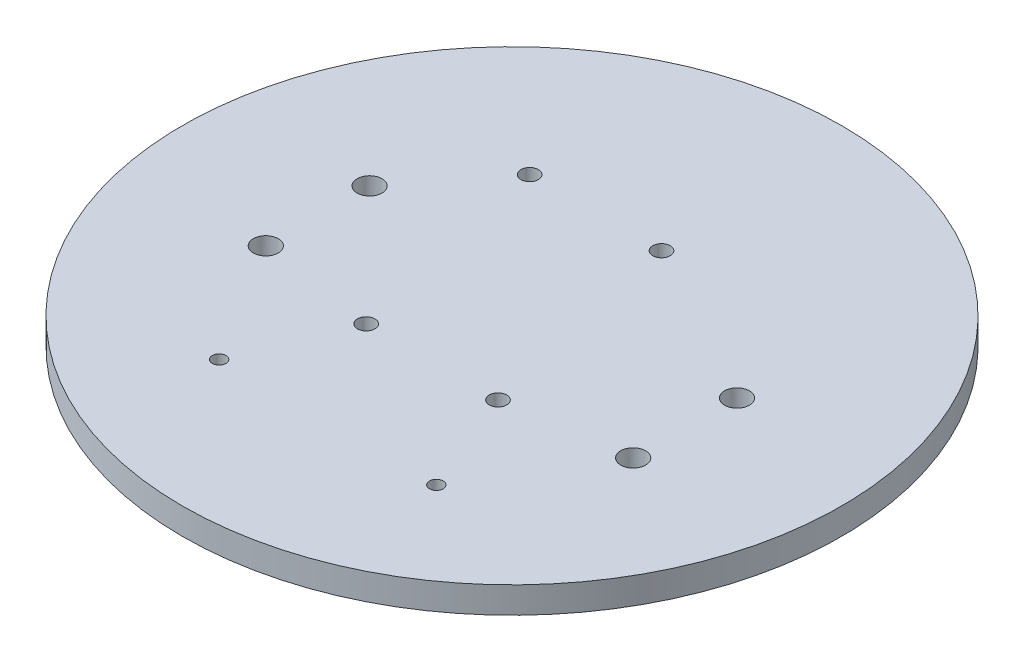
ISO-10303-21;
HEADER;
FILE_DESCRIPTION(('STEP AP214'),'2;1');
FILE_NAME('part.step','',(''),(''),'','','');
FILE_SCHEMA(('AUTOMOTIVE_DESIGN { 1 0 10303 214 1 1 1 1 }'));
ENDSEC;
DATA;
#1=APPLICATION_CONTEXT('core data for automotive mechanical design processes');
#2=APPLICATION_PROTOCOL_DEFINITION('international standard','automotive_design',2000,#1);
#3=PRODUCT_CONTEXT('',#1,'mechanical');
#4=PRODUCT('Part','Part','',(#3));
#5=PRODUCT_RELATED_PRODUCT_CATEGORY('part','',(#4));
#6=PRODUCT_DEFINITION_FORMATION('','',#4);
#7=PRODUCT_DEFINITION_CONTEXT('part definition',#1,'design');
#8=PRODUCT_DEFINITION('design','',#6,#7);
#9=PRODUCT_DEFINITION_SHAPE('','',#8);
#10=(LENGTH_UNIT() NAMED_UNIT(*) SI_UNIT(.MILLI.,.METRE.));
#11=(NAMED_UNIT(*) PLANE_ANGLE_UNIT() SI_UNIT($,.RADIAN.));
#12=(NAMED_UNIT(*) SI_UNIT($,.STERADIAN.) SOLID_ANGLE_UNIT());
#13=UNCERTAINTY_MEASURE_WITH_UNIT(LENGTH_MEASURE(1.E-05),#10,'distance_accuracy_value','');
#14=(GEOMETRIC_REPRESENTATION_CONTEXT(3) GLOBAL_UNCERTAINTY_ASSIGNED_CONTEXT((#13)) GLOBAL_UNIT_ASSIGNED_CONTEXT((#10,
#11,#12)) REPRESENTATION_CONTEXT('',''));
#15=CARTESIAN_POINT('',(0.,0.,0.));
#16=DIRECTION('',(0.,0.,1.));
#17=DIRECTION('',(1.,0.,0.));
#18=AXIS2_PLACEMENT_3D('',#15,#16,#17);
#19=CARTESIAN_POINT('',(0.,3.175,0.));
#20=DIRECTION('',(0.,-1.,0.));
#21=DIRECTION('',(0.,0.,-1.));
#22=AXIS2_PLACEMENT_3D('',#19,#20,#21);
#23=CYLINDRICAL_SURFACE('',#22,79.375);
#24=CARTESIAN_POINT('',(0.,3.175,0.));
#25=DIRECTION('',(0.,1.,0.));
#26=DIRECTION('',(0.,0.,1.));
#27=AXIS2_PLACEMENT_3D('',#24,#25,#26);
#28=CIRCLE('',#27,79.375);
#29=CARTESIAN_POINT('',(0.,3.175,79.375));
#30=VERTEX_POINT('',#29);
#31=EDGE_CURVE('E10',#30,#30,#28,.T.);
#32=ORIENTED_EDGE('',*,*,#31,.F.);
#33=EDGE_LOOP('',(#32));
#34=FACE_BOUND('',#33,.T.);
#35=CARTESIAN_POINT('',(0.,-3.175,0.));
#36=DIRECTION('',(0.,1.,0.));
#37=DIRECTION('',(0.,0.,1.));
#38=AXIS2_PLACEMENT_3D('',#35,#36,#37);
#39=CIRCLE('',#38,79.375);
#40=CARTESIAN_POINT('',(0.,-3.175,79.375));
#41=VERTEX_POINT('',#40);
#42=EDGE_CURVE('E45',#41,#41,#39,.T.);
#43=ORIENTED_EDGE('',*,*,#42,.T.);
#44=EDGE_LOOP('',(#43));
#45=FACE_BOUND('',#44,.T.);
#46=ADVANCED_FACE('F42',(#34,#45),#23,.T.);
#47=CARTESIAN_POINT('',(0.,3.175,0.));
#48=DIRECTION('',(0.,1.,0.));
#49=DIRECTION('',(0.,0.,1.));
#50=AXIS2_PLACEMENT_3D('',#47,#48,#49);
#51=PLANE('',#50);
#52=CARTESIAN_POINT('',(-26.155,3.175,44.3844163281145));
#53=DIRECTION('',(0.,1.,0.));
#54=DIRECTION('',(0.,0.,1.));
#55=AXIS2_PLACEMENT_3D('',#52,#53,#54);
#56=CIRCLE('',#55,1.65);
#57=CARTESIAN_POINT('',(-26.155,3.175,46.0344163281145));
#58=VERTEX_POINT('',#57);
#59=EDGE_CURVE('E110',#58,#58,#56,.T.);
#60=ORIENTED_EDGE('',*,*,#59,.F.);
#61=EDGE_LOOP('',(#60));
#62=FACE_BOUND('',#61,.T.);
#63=CARTESIAN_POINT('',(26.1550000000005,3.175,44.3844163281143));
#64=DIRECTION('',(0.,1.,0.));
#65=DIRECTION('',(0.,0.,1.));
#66=AXIS2_PLACEMENT_3D('',#63,#64,#65);
#67=CIRCLE('',#66,1.65);
#68=CARTESIAN_POINT('',(26.1550000000005,3.175,46.0344163281143));
#69=VERTEX_POINT('',#68);
#70=EDGE_CURVE('E104',#69,#69,#67,.T.);
#71=ORIENTED_EDGE('',*,*,#70,.F.);
#72=EDGE_LOOP('',(#71));
#73=FACE_BOUND('',#72,.T.);
#74=CARTESIAN_POINT('',(-44.245,3.175,-9.94158367188883));
#75=DIRECTION('',(0.,1.,0.));
#76=DIRECTION('',(0.,0.,1.));
#77=AXIS2_PLACEMENT_3D('',#74,#75,#76);
#78=CIRCLE('',#77,3.);
#79=CARTESIAN_POINT('',(-44.245,3.175,-6.94158367188882));
#80=VERTEX_POINT('',#79);
#81=EDGE_CURVE('E98',#80,#80,#78,.T.);
#82=ORIENTED_EDGE('',*,*,#81,.F.);
#83=EDGE_LOOP('',(#82));
#84=FACE_BOUND('',#83,.T.);
#85=CARTESIAN_POINT('',(-44.245,3.175,15.0584163281112));
#86=DIRECTION('',(0.,1.,0.));
#87=DIRECTION('',(0.,0.,1.));
#88=AXIS2_PLACEMENT_3D('',#85,#86,#87);
#89=CIRCLE('',#88,3.);
#90=CARTESIAN_POINT('',(-44.245,3.175,18.0584163281112));
#91=VERTEX_POINT('',#90);
#92=EDGE_CURVE('E92',#91,#91,#89,.T.);
#93=ORIENTED_EDGE('',*,*,#92,.F.);
#94=EDGE_LOOP('',(#93));
#95=FACE_BOUND('',#94,.T.);
#96=CARTESIAN_POINT('',(44.245,3.175,-9.94158367188884));
#97=DIRECTION('',(0.,1.,0.));
#98=DIRECTION('',(0.,0.,1.));
#99=AXIS2_PLACEMENT_3D('',#96,#97,#98);
#100=CIRCLE('',#99,3.);
#101=CARTESIAN_POINT('',(44.245,3.175,-6.94158367188883));
#102=VERTEX_POINT('',#101);
#103=EDGE_CURVE('E86',#102,#102,#100,.T.);
#104=ORIENTED_EDGE('',*,*,#103,.F.);
#105=EDGE_LOOP('',(#104));
#106=FACE_BOUND('',#105,.T.);
#107=CARTESIAN_POINT('',(44.245,3.175,15.0584163281112));
#108=DIRECTION('',(0.,1.,0.));
#109=DIRECTION('',(0.,0.,1.));
#110=AXIS2_PLACEMENT_3D('',#107,#108,#109);
#111=CIRCLE('',#110,3.);
#112=CARTESIAN_POINT('',(44.245,3.175,18.0584163281112));
#113=VERTEX_POINT('',#112);
#114=EDGE_CURVE('E80',#113,#113,#111,.T.);
#115=ORIENTED_EDGE('',*,*,#114,.F.);
#116=EDGE_LOOP('',(#115));
#117=FACE_BOUND('',#116,.T.);
#118=CARTESIAN_POINT('',(-27.3188086,3.175,-31.5711836718892));
#119=DIRECTION('',(0.,1.,0.));
#120=DIRECTION('',(0.,0.,1.));
#121=AXIS2_PLACEMENT_3D('',#118,#119,#120);
#122=CIRCLE('',#121,2.1);
#123=CARTESIAN_POINT('',(-27.3188086,3.175,-29.4711836718892));
#124=VERTEX_POINT('',#123);
#125=EDGE_CURVE('E74',#124,#124,#122,.T.);
#126=ORIENTED_EDGE('',*,*,#125,.F.);
#127=EDGE_LOOP('',(#126));
#128=FACE_BOUND('',#127,.T.);
#129=CARTESIAN_POINT('',(4.4311914,3.175,-31.5711836718892));
#130=DIRECTION('',(0.,1.,0.));
#131=DIRECTION('',(0.,0.,1.));
#132=AXIS2_PLACEMENT_3D('',#129,#130,#131);
#133=CIRCLE('',#132,2.1);
#134=CARTESIAN_POINT('',(4.4311914,3.175,-29.4711836718892));
#135=VERTEX_POINT('',#134);
#136=EDGE_CURVE('E68',#135,#135,#133,.T.);
#137=ORIENTED_EDGE('',*,*,#136,.F.);
#138=EDGE_LOOP('',(#137));
#139=FACE_BOUND('',#138,.T.);
#140=CARTESIAN_POINT('',(-15.875,3.175,19.2459107281112));
#141=DIRECTION('',(0.,1.,0.));
#142=DIRECTION('',(0.,0.,1.));
#143=AXIS2_PLACEMENT_3D('',#140,#141,#142);
#144=CIRCLE('',#143,2.1);
#145=CARTESIAN_POINT('',(-15.875,3.175,21.3459107281112));
#146=VERTEX_POINT('',#145);
#147=EDGE_CURVE('E62',#146,#146,#144,.T.);
#148=ORIENTED_EDGE('',*,*,#147,.F.);
#149=EDGE_LOOP('',(#148));
#150=FACE_BOUND('',#149,.T.);
#151=CARTESIAN_POINT('',(15.875,3.175,19.2459107281112));
#152=DIRECTION('',(0.,1.,0.));
#153=DIRECTION('',(0.,0.,1.));
#154=AXIS2_PLACEMENT_3D('',#151,#152,#153);
#155=CIRCLE('',#154,2.1);
#156=CARTESIAN_POINT('',(15.875,3.175,21.3459107281112));
#157=VERTEX_POINT('',#156);
#158=EDGE_CURVE('E56',#157,#157,#155,.T.);
#159=ORIENTED_EDGE('',*,*,#158,.F.);
#160=EDGE_LOOP('',(#159));
#161=FACE_BOUND('',#160,.T.);
#162=ORIENTED_EDGE('',*,*,#31,.T.);
#163=EDGE_LOOP('',(#162));
#164=FACE_BOUND('',#163,.T.);
#165=ADVANCED_FACE('F116',(#62,#73,#84,#95,#106,#117,#128,#139,#150,#161,#164),#51,.T.);
#166=CARTESIAN_POINT('',(0.,-3.175,0.));
#167=DIRECTION('',(0.,1.,0.));
#168=DIRECTION('',(0.,0.,1.));
#169=AXIS2_PLACEMENT_3D('',#166,#167,#168);
#170=PLANE('',#169);
#171=CARTESIAN_POINT('',(-26.155,-3.175,44.3844163281145));
#172=DIRECTION('',(0.,1.,0.));
#173=DIRECTION('',(0.,0.,1.));
#174=AXIS2_PLACEMENT_3D('',#171,#172,#173);
#175=CIRCLE('',#174,1.65);
#176=CARTESIAN_POINT('',(-26.155,-3.175,46.0344163281145));
#177=VERTEX_POINT('',#176);
#178=EDGE_CURVE('E107',#177,#177,#175,.T.);
#179=ORIENTED_EDGE('',*,*,#178,.T.);
#180=EDGE_LOOP('',(#179));
#181=FACE_BOUND('',#180,.T.);
#182=CARTESIAN_POINT('',(26.1550000000005,-3.175,44.3844163281143));
#183=DIRECTION('',(0.,1.,0.));
#184=DIRECTION('',(0.,0.,1.));
#185=AXIS2_PLACEMENT_3D('',#182,#183,#184);
#186=CIRCLE('',#185,1.65);
#187=CARTESIAN_POINT('',(26.1550000000005,-3.175,46.0344163281143));
#188=VERTEX_POINT('',#187);
#189=EDGE_CURVE('E101',#188,#188,#186,.T.);
#190=ORIENTED_EDGE('',*,*,#189,.T.);
#191=EDGE_LOOP('',(#190));
#192=FACE_BOUND('',#191,.T.);
#193=CARTESIAN_POINT('',(-44.245,-3.175,-9.94158367188883));
#194=DIRECTION('',(0.,1.,0.));
#195=DIRECTION('',(0.,0.,1.));
#196=AXIS2_PLACEMENT_3D('',#193,#194,#195);
#197=CIRCLE('',#196,3.);
#198=CARTESIAN_POINT('',(-44.245,-3.175,-6.94158367188883));
#199=VERTEX_POINT('',#198);
#200=EDGE_CURVE('E95',#199,#199,#197,.T.);
#201=ORIENTED_EDGE('',*,*,#200,.T.);
#202=EDGE_LOOP('',(#201));
#203=FACE_BOUND('',#202,.T.);
#204=CARTESIAN_POINT('',(-44.245,-3.175,15.0584163281112));
#205=DIRECTION('',(0.,1.,0.));
#206=DIRECTION('',(0.,0.,1.));
#207=AXIS2_PLACEMENT_3D('',#204,#205,#206);
#208=CIRCLE('',#207,3.);
#209=CARTESIAN_POINT('',(-44.245,-3.175,18.0584163281112));
#210=VERTEX_POINT('',#209);
#211=EDGE_CURVE('E89',#210,#210,#208,.T.);
#212=ORIENTED_EDGE('',*,*,#211,.T.);
#213=EDGE_LOOP('',(#212));
#214=FACE_BOUND('',#213,.T.);
#215=CARTESIAN_POINT('',(44.245,-3.175,-9.94158367188884));
#216=DIRECTION('',(0.,1.,0.));
#217=DIRECTION('',(0.,0.,1.));
#218=AXIS2_PLACEMENT_3D('',#215,#216,#217);
#219=CIRCLE('',#218,3.);
#220=CARTESIAN_POINT('',(44.245,-3.175,-6.94158367188884));
#221=VERTEX_POINT('',#220);
#222=EDGE_CURVE('E83',#221,#221,#219,.T.);
#223=ORIENTED_EDGE('',*,*,#222,.T.);
#224=EDGE_LOOP('',(#223));
#225=FACE_BOUND('',#224,.T.);
#226=CARTESIAN_POINT('',(44.245,-3.175,15.0584163281112));
#227=DIRECTION('',(0.,1.,0.));
#228=DIRECTION('',(0.,0.,1.));
#229=AXIS2_PLACEMENT_3D('',#226,#227,#228);
#230=CIRCLE('',#229,3.);
#231=CARTESIAN_POINT('',(44.245,-3.175,18.0584163281112));
#232=VERTEX_POINT('',#231);
#233=EDGE_CURVE('E77',#232,#232,#230,.T.);
#234=ORIENTED_EDGE('',*,*,#233,.T.);
#235=EDGE_LOOP('',(#234));
#236=FACE_BOUND('',#235,.T.);
#237=CARTESIAN_POINT('',(-27.3188086,-3.175,-31.5711836718892));
#238=DIRECTION('',(0.,1.,0.));
#239=DIRECTION('',(0.,0.,1.));
#240=AXIS2_PLACEMENT_3D('',#237,#238,#239);
#241=CIRCLE('',#240,2.1);
#242=CARTESIAN_POINT('',(-27.3188086,-3.175,-29.4711836718892));
#243=VERTEX_POINT('',#242);
#244=EDGE_CURVE('E71',#243,#243,#241,.T.);
#245=ORIENTED_EDGE('',*,*,#244,.T.);
#246=EDGE_LOOP('',(#245));
#247=FACE_BOUND('',#246,.T.);
#248=CARTESIAN_POINT('',(4.4311914,-3.175,-31.5711836718892));
#249=DIRECTION('',(0.,1.,0.));
#250=DIRECTION('',(0.,0.,1.));
#251=AXIS2_PLACEMENT_3D('',#248,#249,#250);
#252=CIRCLE('',#251,2.1);
#253=CARTESIAN_POINT('',(4.4311914,-3.175,-29.4711836718892));
#254=VERTEX_POINT('',#253);
#255=EDGE_CURVE('E65',#254,#254,#252,.T.);
#256=ORIENTED_EDGE('',*,*,#255,.T.);
#257=EDGE_LOOP('',(#256));
#258=FACE_BOUND('',#257,.T.);
#259=CARTESIAN_POINT('',(-15.875,-3.175,19.2459107281112));
#260=DIRECTION('',(0.,1.,0.));
#261=DIRECTION('',(0.,0.,1.));
#262=AXIS2_PLACEMENT_3D('',#259,#260,#261);
#263=CIRCLE('',#262,2.1);
#264=CARTESIAN_POINT('',(-15.875,-3.175,21.3459107281112));
#265=VERTEX_POINT('',#264);
#266=EDGE_CURVE('E59',#265,#265,#263,.T.);
#267=ORIENTED_EDGE('',*,*,#266,.T.);
#268=EDGE_LOOP('',(#267));
#269=FACE_BOUND('',#268,.T.);
#270=CARTESIAN_POINT('',(15.875,-3.175,19.2459107281112));
#271=DIRECTION('',(0.,1.,0.));
#272=DIRECTION('',(0.,0.,1.));
#273=AXIS2_PLACEMENT_3D('',#270,#271,#272);
#274=CIRCLE('',#273,2.1);
#275=CARTESIAN_POINT('',(15.875,-3.175,21.3459107281112));
#276=VERTEX_POINT('',#275);
#277=EDGE_CURVE('E52',#276,#276,#274,.T.);
#278=ORIENTED_EDGE('',*,*,#277,.T.);
#279=EDGE_LOOP('',(#278));
#280=FACE_BOUND('',#279,.T.);
#281=ORIENTED_EDGE('',*,*,#42,.F.);
#282=EDGE_LOOP('',(#281));
#283=FACE_BOUND('',#282,.T.);
#284=ADVANCED_FACE('F119',(#181,#192,#203,#214,#225,#236,#247,#258,#269,#280,#283),#170,.F.);
#285=CARTESIAN_POINT('',(15.875,3.175,19.2459107281112));
#286=DIRECTION('',(0.,1.,0.));
#287=DIRECTION('',(0.,0.,1.));
#288=AXIS2_PLACEMENT_3D('',#285,#286,#287);
#289=CYLINDRICAL_SURFACE('',#288,2.1);
#290=ORIENTED_EDGE('',*,*,#277,.F.);
#291=EDGE_LOOP('',(#290));
#292=FACE_BOUND('',#291,.T.);
#293=ORIENTED_EDGE('',*,*,#158,.T.);
#294=EDGE_LOOP('',(#293));
#295=FACE_BOUND('',#294,.T.);
#296=ADVANCED_FACE('F139',(#292,#295),#289,.F.);
#297=CARTESIAN_POINT('',(-15.875,3.175,19.2459107281112));
#298=DIRECTION('',(0.,1.,0.));
#299=DIRECTION('',(0.,0.,1.));
#300=AXIS2_PLACEMENT_3D('',#297,#298,#299);
#301=CYLINDRICAL_SURFACE('',#300,2.1);
#302=ORIENTED_EDGE('',*,*,#266,.F.);
#303=EDGE_LOOP('',(#302));
#304=FACE_BOUND('',#303,.T.);
#305=ORIENTED_EDGE('',*,*,#147,.T.);
#306=EDGE_LOOP('',(#305));
#307=FACE_BOUND('',#306,.T.);
#308=ADVANCED_FACE('F141',(#304,#307),#301,.F.);
#309=CARTESIAN_POINT('',(4.4311914,3.175,-31.5711836718892));
#310=DIRECTION('',(0.,1.,0.));
#311=DIRECTION('',(0.,0.,1.));
#312=AXIS2_PLACEMENT_3D('',#309,#310,#311);
#313=CYLINDRICAL_SURFACE('',#312,2.1);
#314=ORIENTED_EDGE('',*,*,#255,.F.);
#315=EDGE_LOOP('',(#314));
#316=FACE_BOUND('',#315,.T.);
#317=ORIENTED_EDGE('',*,*,#136,.T.);
#318=EDGE_LOOP('',(#317));
#319=FACE_BOUND('',#318,.T.);
#320=ADVANCED_FACE('F148',(#316,#319),#313,.F.);
#321=CARTESIAN_POINT('',(-27.3188086,3.175,-31.5711836718892));
#322=DIRECTION('',(0.,1.,0.));
#323=DIRECTION('',(0.,0.,1.));
#324=AXIS2_PLACEMENT_3D('',#321,#322,#323);
#325=CYLINDRICAL_SURFACE('',#324,2.1);
#326=ORIENTED_EDGE('',*,*,#244,.F.);
#327=EDGE_LOOP('',(#326));
#328=FACE_BOUND('',#327,.T.);
#329=ORIENTED_EDGE('',*,*,#125,.T.);
#330=EDGE_LOOP('',(#329));
#331=FACE_BOUND('',#330,.T.);
#332=ADVANCED_FACE('F236',(#328,#331),#325,.F.);
#333=CARTESIAN_POINT('',(44.245,3.175,15.0584163281112));
#334=DIRECTION('',(0.,1.,0.));
#335=DIRECTION('',(0.,0.,1.));
#336=AXIS2_PLACEMENT_3D('',#333,#334,#335);
#337=CYLINDRICAL_SURFACE('',#336,3.);
#338=ORIENTED_EDGE('',*,*,#233,.F.);
#339=EDGE_LOOP('',(#338));
#340=FACE_BOUND('',#339,.T.);
#341=ORIENTED_EDGE('',*,*,#114,.T.);
#342=EDGE_LOOP('',(#341));
#343=FACE_BOUND('',#342,.T.);
#344=ADVANCED_FACE('F226',(#340,#343),#337,.F.);
#345=CARTESIAN_POINT('',(44.245,3.175,-9.94158367188884));
#346=DIRECTION('',(0.,1.,0.));
#347=DIRECTION('',(0.,0.,1.));
#348=AXIS2_PLACEMENT_3D('',#345,#346,#347);
#349=CYLINDRICAL_SURFACE('',#348,3.);
#350=ORIENTED_EDGE('',*,*,#222,.F.);
#351=EDGE_LOOP('',(#350));
#352=FACE_BOUND('',#351,.T.);
#353=ORIENTED_EDGE('',*,*,#103,.T.);
#354=EDGE_LOOP('',(#353));
#355=FACE_BOUND('',#354,.T.);
#356=ADVANCED_FACE('F216',(#352,#355),#349,.F.);
#357=CARTESIAN_POINT('',(-44.245,3.175,15.0584163281112));
#358=DIRECTION('',(0.,1.,0.));
#359=DIRECTION('',(0.,0.,1.));
#360=AXIS2_PLACEMENT_3D('',#357,#358,#359);
#361=CYLINDRICAL_SURFACE('',#360,3.);
#362=ORIENTED_EDGE('',*,*,#211,.F.);
#363=EDGE_LOOP('',(#362));
#364=FACE_BOUND('',#363,.T.);
#365=ORIENTED_EDGE('',*,*,#92,.T.);
#366=EDGE_LOOP('',(#365));
#367=FACE_BOUND('',#366,.T.);
#368=ADVANCED_FACE('F207',(#364,#367),#361,.F.);
#369=CARTESIAN_POINT('',(-44.245,3.175,-9.94158367188883));
#370=DIRECTION('',(0.,1.,0.));
#371=DIRECTION('',(0.,0.,1.));
#372=AXIS2_PLACEMENT_3D('',#369,#370,#371);
#373=CYLINDRICAL_SURFACE('',#372,3.);
#374=ORIENTED_EDGE('',*,*,#200,.F.);
#375=EDGE_LOOP('',(#374));
#376=FACE_BOUND('',#375,.T.);
#377=ORIENTED_EDGE('',*,*,#81,.T.);
#378=EDGE_LOOP('',(#377));
#379=FACE_BOUND('',#378,.T.);
#380=ADVANCED_FACE('F184',(#376,#379),#373,.F.);
#381=CARTESIAN_POINT('',(26.1550000000005,3.175,44.3844163281143));
#382=DIRECTION('',(0.,1.,0.));
#383=DIRECTION('',(0.,0.,1.));
#384=AXIS2_PLACEMENT_3D('',#381,#382,#383);
#385=CYLINDRICAL_SURFACE('',#384,1.65);
#386=ORIENTED_EDGE('',*,*,#189,.F.);
#387=EDGE_LOOP('',(#386));
#388=FACE_BOUND('',#387,.T.);
#389=ORIENTED_EDGE('',*,*,#70,.T.);
#390=EDGE_LOOP('',(#389));
#391=FACE_BOUND('',#390,.T.);
#392=ADVANCED_FACE('F179',(#388,#391),#385,.F.);
#393=CARTESIAN_POINT('',(-26.155,3.175,44.3844163281145));
#394=DIRECTION('',(0.,1.,0.));
#395=DIRECTION('',(0.,0.,1.));
#396=AXIS2_PLACEMENT_3D('',#393,#394,#395);
#397=CYLINDRICAL_SURFACE('',#396,1.65);
#398=ORIENTED_EDGE('',*,*,#178,.F.);
#399=EDGE_LOOP('',(#398));
#400=FACE_BOUND('',#399,.T.);
#401=ORIENTED_EDGE('',*,*,#59,.T.);
#402=EDGE_LOOP('',(#401));
#403=FACE_BOUND('',#402,.T.);
#404=ADVANCED_FACE('F114',(#400,#403),#397,.F.);
#405=CLOSED_SHELL('',(#46,#165,#284,#296,#308,#320,#332,#344,#356,#368,#380,#392,#404));
#406=MANIFOLD_SOLID_BREP('B2',#405);
#407=ADVANCED_BREP_SHAPE_REPRESENTATION('',(#18,#406),#14);
#408=SHAPE_DEFINITION_REPRESENTATION(#9,#407);
ENDSEC;
END-ISO-10303-21;
